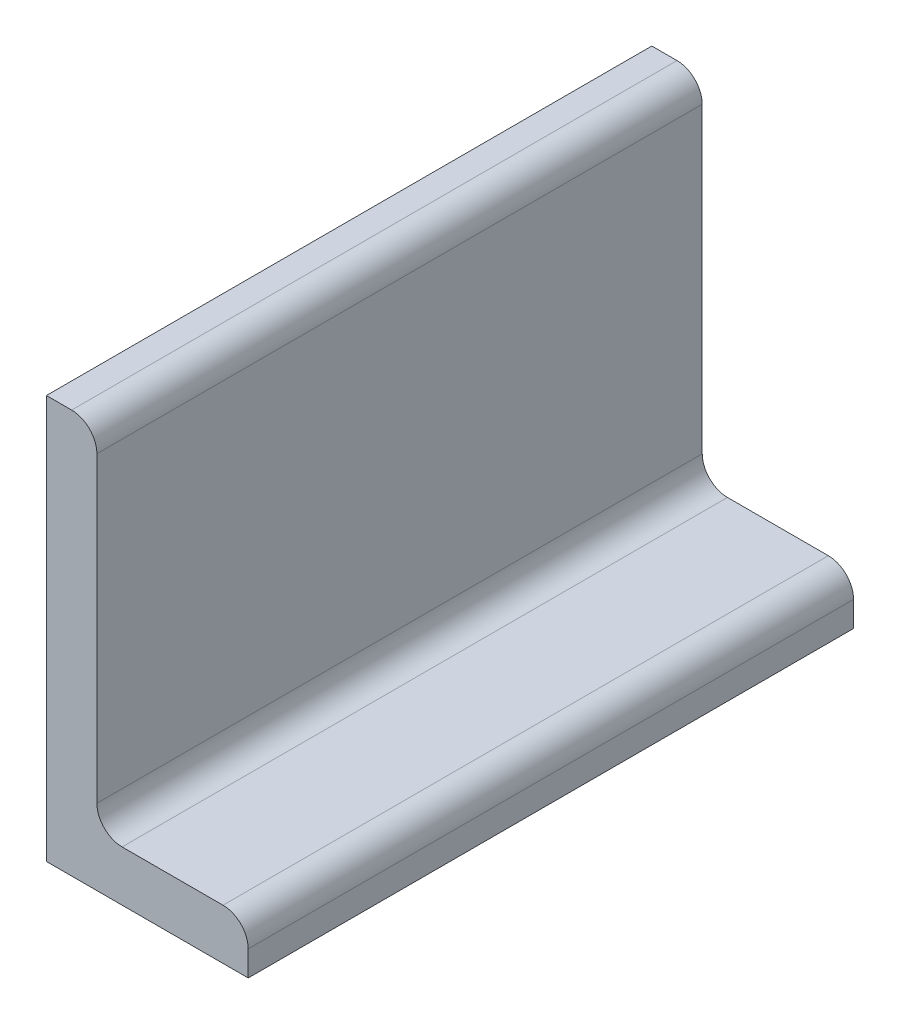
ISO-10303-21;
HEADER;
FILE_DESCRIPTION(('STEP AP214'),'2;1');
FILE_NAME('part.step','',(''),(''),'','','');
FILE_SCHEMA(('AUTOMOTIVE_DESIGN { 1 0 10303 214 1 1 1 1 }'));
ENDSEC;
DATA;
#1=APPLICATION_CONTEXT('core data for automotive mechanical design processes');
#2=APPLICATION_PROTOCOL_DEFINITION('international standard','automotive_design',2000,#1);
#3=PRODUCT_CONTEXT('',#1,'mechanical');
#4=PRODUCT('Part','Part','',(#3));
#5=PRODUCT_RELATED_PRODUCT_CATEGORY('part','',(#4));
#6=PRODUCT_DEFINITION_FORMATION('','',#4);
#7=PRODUCT_DEFINITION_CONTEXT('part definition',#1,'design');
#8=PRODUCT_DEFINITION('design','',#6,#7);
#9=PRODUCT_DEFINITION_SHAPE('','',#8);
#10=(LENGTH_UNIT() NAMED_UNIT(*) SI_UNIT(.MILLI.,.METRE.));
#11=(NAMED_UNIT(*) PLANE_ANGLE_UNIT() SI_UNIT($,.RADIAN.));
#12=(NAMED_UNIT(*) SI_UNIT($,.STERADIAN.) SOLID_ANGLE_UNIT());
#13=UNCERTAINTY_MEASURE_WITH_UNIT(LENGTH_MEASURE(1.E-05),#10,'distance_accuracy_value','');
#14=(GEOMETRIC_REPRESENTATION_CONTEXT(3) GLOBAL_UNCERTAINTY_ASSIGNED_CONTEXT((#13)) GLOBAL_UNIT_ASSIGNED_CONTEXT((#10,
#11,#12)) REPRESENTATION_CONTEXT('',''));
#15=CARTESIAN_POINT('',(0.,0.,0.));
#16=DIRECTION('',(0.,0.,1.));
#17=DIRECTION('',(1.,0.,0.));
#18=AXIS2_PLACEMENT_3D('',#15,#16,#17);
#19=CARTESIAN_POINT('',(0.865045893659089,203.678837479772,304.8));
#20=DIRECTION('',(1.,0.,0.));
#21=DIRECTION('',(0.,0.,-1.));
#22=AXIS2_PLACEMENT_3D('',#19,#20,#21);
#23=PLANE('',#22);
#24=DIRECTION('',(0.,-1.,0.));
#25=VECTOR('',#24,1.);
#26=CARTESIAN_POINT('',(0.865045893659089,203.678837479772,0.));
#27=LINE('',#26,#25);
#28=CARTESIAN_POINT('',(0.865045893659089,203.678837479772,0.));
#29=VERTEX_POINT('',#28);
#30=CARTESIAN_POINT('',(0.865045893659089,0.478837479771708,0.));
#31=VERTEX_POINT('',#30);
#32=EDGE_CURVE('E135',#29,#31,#27,.T.);
#33=ORIENTED_EDGE('',*,*,#32,.T.);
#34=DIRECTION('',(0.,0.,-1.));
#35=VECTOR('',#34,1.);
#36=CARTESIAN_POINT('',(0.865045893659089,0.478837479771708,304.8));
#37=LINE('',#36,#35);
#38=CARTESIAN_POINT('',(0.865045893659089,0.478837479771708,304.8));
#39=VERTEX_POINT('',#38);
#40=EDGE_CURVE('E11',#39,#31,#37,.T.);
#41=ORIENTED_EDGE('',*,*,#40,.F.);
#42=DIRECTION('',(0.,-1.,0.));
#43=VECTOR('',#42,1.);
#44=CARTESIAN_POINT('',(0.865045893659089,203.678837479772,304.8));
#45=LINE('',#44,#43);
#46=CARTESIAN_POINT('',(0.865045893659089,203.678837479772,304.8));
#47=VERTEX_POINT('',#46);
#48=EDGE_CURVE('E151',#47,#39,#45,.T.);
#49=ORIENTED_EDGE('',*,*,#48,.F.);
#50=DIRECTION('',(0.,0.,-1.));
#51=VECTOR('',#50,1.);
#52=CARTESIAN_POINT('',(0.865045893659089,203.678837479772,304.8));
#53=LINE('',#52,#51);
#54=EDGE_CURVE('E131',#47,#29,#53,.T.);
#55=ORIENTED_EDGE('',*,*,#54,.T.);
#56=EDGE_LOOP('',(#33,#41,#49,#55));
#57=FACE_BOUND('',#56,.T.);
#58=ADVANCED_FACE('F33',(#57),#23,.F.);
#59=CARTESIAN_POINT('',(0.865045893659089,0.478837479771708,304.8));
#60=DIRECTION('',(0.,1.,0.));
#61=DIRECTION('',(0.,0.,1.));
#62=AXIS2_PLACEMENT_3D('',#59,#60,#61);
#63=PLANE('',#62);
#64=DIRECTION('',(1.,0.,0.));
#65=VECTOR('',#64,1.);
#66=CARTESIAN_POINT('',(0.865045893659089,0.478837479771708,0.));
#67=LINE('',#66,#65);
#68=CARTESIAN_POINT('',(102.465045893659,0.478837479771708,0.));
#69=VERTEX_POINT('',#68);
#70=EDGE_CURVE('E138',#31,#69,#67,.T.);
#71=ORIENTED_EDGE('',*,*,#70,.T.);
#72=DIRECTION('',(0.,0.,-1.));
#73=VECTOR('',#72,1.);
#74=CARTESIAN_POINT('',(102.465045893659,0.478837479771708,304.8));
#75=LINE('',#74,#73);
#76=CARTESIAN_POINT('',(102.465045893659,0.478837479771708,304.8));
#77=VERTEX_POINT('',#76);
#78=EDGE_CURVE('E41',#77,#69,#75,.T.);
#79=ORIENTED_EDGE('',*,*,#78,.F.);
#80=DIRECTION('',(1.,0.,0.));
#81=VECTOR('',#80,1.);
#82=CARTESIAN_POINT('',(0.865045893659089,0.478837479771708,304.8));
#83=LINE('',#82,#81);
#84=EDGE_CURVE('E95',#39,#77,#83,.T.);
#85=ORIENTED_EDGE('',*,*,#84,.F.);
#86=ORIENTED_EDGE('',*,*,#40,.T.);
#87=EDGE_LOOP('',(#71,#79,#85,#86));
#88=FACE_BOUND('',#87,.T.);
#89=ADVANCED_FACE('F194',(#88),#63,.F.);
#90=CARTESIAN_POINT('',(102.465045893659,0.478837479771708,304.8));
#91=DIRECTION('',(-1.,0.,0.));
#92=DIRECTION('',(0.,0.,1.));
#93=AXIS2_PLACEMENT_3D('',#90,#91,#92);
#94=PLANE('',#93);
#95=DIRECTION('',(0.,1.,0.));
#96=VECTOR('',#95,1.);
#97=CARTESIAN_POINT('',(102.465045893659,0.478837479771708,0.));
#98=LINE('',#97,#96);
#99=CARTESIAN_POINT('',(102.465045893659,13.1788374797717,0.));
#100=VERTEX_POINT('',#99);
#101=EDGE_CURVE('E140',#69,#100,#98,.T.);
#102=ORIENTED_EDGE('',*,*,#101,.T.);
#103=DIRECTION('',(0.,0.,-1.));
#104=VECTOR('',#103,1.);
#105=CARTESIAN_POINT('',(102.465045893659,13.1788374797717,304.8));
#106=LINE('',#105,#104);
#107=CARTESIAN_POINT('',(102.465045893659,13.1788374797717,304.8));
#108=VERTEX_POINT('',#107);
#109=EDGE_CURVE('E161',#108,#100,#106,.T.);
#110=ORIENTED_EDGE('',*,*,#109,.F.);
#111=DIRECTION('',(0.,1.,0.));
#112=VECTOR('',#111,1.);
#113=CARTESIAN_POINT('',(102.465045893659,0.478837479771708,304.8));
#114=LINE('',#113,#112);
#115=EDGE_CURVE('E169',#77,#108,#114,.T.);
#116=ORIENTED_EDGE('',*,*,#115,.F.);
#117=ORIENTED_EDGE('',*,*,#78,.T.);
#118=EDGE_LOOP('',(#102,#110,#116,#117));
#119=FACE_BOUND('',#118,.T.);
#120=ADVANCED_FACE('F167',(#119),#94,.F.);
#121=CARTESIAN_POINT('',(89.7650458936591,13.1788374797717,304.8));
#122=DIRECTION('',(0.,0.,-1.));
#123=DIRECTION('',(-1.,0.,0.));
#124=AXIS2_PLACEMENT_3D('',#121,#122,#123);
#125=CYLINDRICAL_SURFACE('',#124,12.7);
#126=CARTESIAN_POINT('',(89.7650458936591,13.1788374797717,0.));
#127=DIRECTION('',(0.,0.,1.));
#128=DIRECTION('',(1.,0.,0.));
#129=AXIS2_PLACEMENT_3D('',#126,#127,#128);
#130=CIRCLE('',#129,12.7);
#131=CARTESIAN_POINT('',(89.7650458936591,25.8788374797717,0.));
#132=VERTEX_POINT('',#131);
#133=EDGE_CURVE('E142',#100,#132,#130,.T.);
#134=ORIENTED_EDGE('',*,*,#133,.T.);
#135=DIRECTION('',(0.,0.,-1.));
#136=VECTOR('',#135,1.);
#137=CARTESIAN_POINT('',(89.7650458936591,25.8788374797717,304.8));
#138=LINE('',#137,#136);
#139=CARTESIAN_POINT('',(89.7650458936591,25.8788374797717,304.8));
#140=VERTEX_POINT('',#139);
#141=EDGE_CURVE('E158',#140,#132,#138,.T.);
#142=ORIENTED_EDGE('',*,*,#141,.F.);
#143=CARTESIAN_POINT('',(89.7650458936591,13.1788374797717,304.8));
#144=DIRECTION('',(0.,0.,1.));
#145=DIRECTION('',(1.,0.,0.));
#146=AXIS2_PLACEMENT_3D('',#143,#144,#145);
#147=CIRCLE('',#146,12.7);
#148=EDGE_CURVE('E185',#108,#140,#147,.T.);
#149=ORIENTED_EDGE('',*,*,#148,.F.);
#150=ORIENTED_EDGE('',*,*,#109,.T.);
#151=EDGE_LOOP('',(#134,#142,#149,#150));
#152=FACE_BOUND('',#151,.T.);
#153=ADVANCED_FACE('F178',(#152),#125,.T.);
#154=CARTESIAN_POINT('',(89.7650458936591,25.8788374797717,304.8));
#155=DIRECTION('',(0.,-1.,0.));
#156=DIRECTION('',(0.,0.,-1.));
#157=AXIS2_PLACEMENT_3D('',#154,#155,#156);
#158=PLANE('',#157);
#159=DIRECTION('',(-1.,0.,0.));
#160=VECTOR('',#159,1.);
#161=CARTESIAN_POINT('',(89.7650458936591,25.8788374797717,0.));
#162=LINE('',#161,#160);
#163=CARTESIAN_POINT('',(38.9650458936591,25.8788374797717,0.));
#164=VERTEX_POINT('',#163);
#165=EDGE_CURVE('E144',#132,#164,#162,.T.);
#166=ORIENTED_EDGE('',*,*,#165,.T.);
#167=DIRECTION('',(0.,0.,-1.));
#168=VECTOR('',#167,1.);
#169=CARTESIAN_POINT('',(38.9650458936591,25.8788374797717,304.8));
#170=LINE('',#169,#168);
#171=CARTESIAN_POINT('',(38.9650458936591,25.8788374797717,304.8));
#172=VERTEX_POINT('',#171);
#173=EDGE_CURVE('E155',#172,#164,#170,.T.);
#174=ORIENTED_EDGE('',*,*,#173,.F.);
#175=DIRECTION('',(-1.,0.,0.));
#176=VECTOR('',#175,1.);
#177=CARTESIAN_POINT('',(89.7650458936591,25.8788374797717,304.8));
#178=LINE('',#177,#176);
#179=EDGE_CURVE('E184',#140,#172,#178,.T.);
#180=ORIENTED_EDGE('',*,*,#179,.F.);
#181=ORIENTED_EDGE('',*,*,#141,.T.);
#182=EDGE_LOOP('',(#166,#174,#180,#181));
#183=FACE_BOUND('',#182,.T.);
#184=ADVANCED_FACE('F182',(#183),#158,.F.);
#185=CARTESIAN_POINT('',(38.9650458936591,38.5788374797717,304.8));
#186=DIRECTION('',(0.,0.,-1.));
#187=DIRECTION('',(-1.,0.,0.));
#188=AXIS2_PLACEMENT_3D('',#185,#186,#187);
#189=CYLINDRICAL_SURFACE('',#188,12.7);
#190=CARTESIAN_POINT('',(38.9650458936591,38.5788374797717,0.));
#191=DIRECTION('',(0.,0.,-1.));
#192=DIRECTION('',(1.,0.,0.));
#193=AXIS2_PLACEMENT_3D('',#190,#191,#192);
#194=CIRCLE('',#193,12.7);
#195=CARTESIAN_POINT('',(26.2650458936591,38.5788374797717,0.));
#196=VERTEX_POINT('',#195);
#197=EDGE_CURVE('E146',#164,#196,#194,.T.);
#198=ORIENTED_EDGE('',*,*,#197,.T.);
#199=DIRECTION('',(0.,0.,-1.));
#200=VECTOR('',#199,1.);
#201=CARTESIAN_POINT('',(26.2650458936591,38.5788374797717,304.8));
#202=LINE('',#201,#200);
#203=CARTESIAN_POINT('',(26.2650458936591,38.5788374797717,304.8));
#204=VERTEX_POINT('',#203);
#205=EDGE_CURVE('E126',#204,#196,#202,.T.);
#206=ORIENTED_EDGE('',*,*,#205,.F.);
#207=CARTESIAN_POINT('',(38.9650458936591,38.5788374797717,304.8));
#208=DIRECTION('',(0.,0.,-1.));
#209=DIRECTION('',(1.,0.,0.));
#210=AXIS2_PLACEMENT_3D('',#207,#208,#209);
#211=CIRCLE('',#210,12.7);
#212=EDGE_CURVE('E117',#172,#204,#211,.T.);
#213=ORIENTED_EDGE('',*,*,#212,.F.);
#214=ORIENTED_EDGE('',*,*,#173,.T.);
#215=EDGE_LOOP('',(#198,#206,#213,#214));
#216=FACE_BOUND('',#215,.T.);
#217=ADVANCED_FACE('F206',(#216),#189,.F.);
#218=CARTESIAN_POINT('',(26.2650458936591,38.5788374797717,304.8));
#219=DIRECTION('',(-1.,0.,0.));
#220=DIRECTION('',(0.,0.,1.));
#221=AXIS2_PLACEMENT_3D('',#218,#219,#220);
#222=PLANE('',#221);
#223=DIRECTION('',(0.,1.,0.));
#224=VECTOR('',#223,1.);
#225=CARTESIAN_POINT('',(26.2650458936591,38.5788374797717,0.));
#226=LINE('',#225,#224);
#227=CARTESIAN_POINT('',(26.2650458936591,190.978837479772,0.));
#228=VERTEX_POINT('',#227);
#229=EDGE_CURVE('E125',#196,#228,#226,.T.);
#230=ORIENTED_EDGE('',*,*,#229,.T.);
#231=DIRECTION('',(0.,0.,-1.));
#232=VECTOR('',#231,1.);
#233=CARTESIAN_POINT('',(26.2650458936591,190.978837479772,304.8));
#234=LINE('',#233,#232);
#235=CARTESIAN_POINT('',(26.2650458936591,190.978837479772,304.8));
#236=VERTEX_POINT('',#235);
#237=EDGE_CURVE('E122',#236,#228,#234,.T.);
#238=ORIENTED_EDGE('',*,*,#237,.F.);
#239=DIRECTION('',(0.,1.,0.));
#240=VECTOR('',#239,1.);
#241=CARTESIAN_POINT('',(26.2650458936591,38.5788374797717,304.8));
#242=LINE('',#241,#240);
#243=EDGE_CURVE('E111',#204,#236,#242,.T.);
#244=ORIENTED_EDGE('',*,*,#243,.F.);
#245=ORIENTED_EDGE('',*,*,#205,.T.);
#246=EDGE_LOOP('',(#230,#238,#244,#245));
#247=FACE_BOUND('',#246,.T.);
#248=ADVANCED_FACE('F123',(#247),#222,.F.);
#249=CARTESIAN_POINT('',(13.5650458936591,190.978837479772,304.8));
#250=DIRECTION('',(0.,0.,-1.));
#251=DIRECTION('',(-1.,0.,0.));
#252=AXIS2_PLACEMENT_3D('',#249,#250,#251);
#253=CYLINDRICAL_SURFACE('',#252,12.7);
#254=CARTESIAN_POINT('',(13.5650458936591,190.978837479772,0.));
#255=DIRECTION('',(0.,0.,1.));
#256=DIRECTION('',(1.,0.,0.));
#257=AXIS2_PLACEMENT_3D('',#254,#255,#256);
#258=CIRCLE('',#257,12.7);
#259=CARTESIAN_POINT('',(13.5650458936591,203.678837479772,0.));
#260=VERTEX_POINT('',#259);
#261=EDGE_CURVE('E81',#228,#260,#258,.T.);
#262=ORIENTED_EDGE('',*,*,#261,.T.);
#263=DIRECTION('',(0.,0.,-1.));
#264=VECTOR('',#263,1.);
#265=CARTESIAN_POINT('',(13.5650458936591,203.678837479772,304.8));
#266=LINE('',#265,#264);
#267=CARTESIAN_POINT('',(13.5650458936591,203.678837479772,304.8));
#268=VERTEX_POINT('',#267);
#269=EDGE_CURVE('E127',#268,#260,#266,.T.);
#270=ORIENTED_EDGE('',*,*,#269,.F.);
#271=CARTESIAN_POINT('',(13.5650458936591,190.978837479772,304.8));
#272=DIRECTION('',(0.,0.,1.));
#273=DIRECTION('',(1.,0.,0.));
#274=AXIS2_PLACEMENT_3D('',#271,#272,#273);
#275=CIRCLE('',#274,12.7);
#276=EDGE_CURVE('E115',#236,#268,#275,.T.);
#277=ORIENTED_EDGE('',*,*,#276,.F.);
#278=ORIENTED_EDGE('',*,*,#237,.T.);
#279=EDGE_LOOP('',(#262,#270,#277,#278));
#280=FACE_BOUND('',#279,.T.);
#281=ADVANCED_FACE('F129',(#280),#253,.T.);
#282=CARTESIAN_POINT('',(13.5650458936591,203.678837479772,304.8));
#283=DIRECTION('',(0.,-1.,0.));
#284=DIRECTION('',(0.,0.,-1.));
#285=AXIS2_PLACEMENT_3D('',#282,#283,#284);
#286=PLANE('',#285);
#287=DIRECTION('',(-1.,0.,0.));
#288=VECTOR('',#287,1.);
#289=CARTESIAN_POINT('',(13.5650458936591,203.678837479772,0.));
#290=LINE('',#289,#288);
#291=EDGE_CURVE('E87',#260,#29,#290,.T.);
#292=ORIENTED_EDGE('',*,*,#291,.T.);
#293=ORIENTED_EDGE('',*,*,#54,.F.);
#294=DIRECTION('',(-1.,0.,0.));
#295=VECTOR('',#294,1.);
#296=CARTESIAN_POINT('',(13.5650458936591,203.678837479772,304.8));
#297=LINE('',#296,#295);
#298=EDGE_CURVE('E49',#268,#47,#297,.T.);
#299=ORIENTED_EDGE('',*,*,#298,.F.);
#300=ORIENTED_EDGE('',*,*,#269,.T.);
#301=EDGE_LOOP('',(#292,#293,#299,#300));
#302=FACE_BOUND('',#301,.T.);
#303=ADVANCED_FACE('F214',(#302),#286,.F.);
#304=CARTESIAN_POINT('',(89.7650458936591,13.1788374797717,304.8));
#305=DIRECTION('',(0.,0.,1.));
#306=DIRECTION('',(1.,0.,0.));
#307=AXIS2_PLACEMENT_3D('',#304,#305,#306);
#308=PLANE('',#307);
#309=ORIENTED_EDGE('',*,*,#48,.T.);
#310=ORIENTED_EDGE('',*,*,#84,.T.);
#311=ORIENTED_EDGE('',*,*,#115,.T.);
#312=ORIENTED_EDGE('',*,*,#148,.T.);
#313=ORIENTED_EDGE('',*,*,#179,.T.);
#314=ORIENTED_EDGE('',*,*,#212,.T.);
#315=ORIENTED_EDGE('',*,*,#243,.T.);
#316=ORIENTED_EDGE('',*,*,#276,.T.);
#317=ORIENTED_EDGE('',*,*,#298,.T.);
#318=EDGE_LOOP('',(#309,#310,#311,#312,#313,#314,#315,#316,#317));
#319=FACE_BOUND('',#318,.T.);
#320=ADVANCED_FACE('F113',(#319),#308,.T.);
#321=CARTESIAN_POINT('',(89.7650458936591,13.1788374797717,0.));
#322=DIRECTION('',(0.,0.,1.));
#323=DIRECTION('',(1.,0.,0.));
#324=AXIS2_PLACEMENT_3D('',#321,#322,#323);
#325=PLANE('',#324);
#326=ORIENTED_EDGE('',*,*,#32,.F.);
#327=ORIENTED_EDGE('',*,*,#291,.F.);
#328=ORIENTED_EDGE('',*,*,#261,.F.);
#329=ORIENTED_EDGE('',*,*,#229,.F.);
#330=ORIENTED_EDGE('',*,*,#197,.F.);
#331=ORIENTED_EDGE('',*,*,#165,.F.);
#332=ORIENTED_EDGE('',*,*,#133,.F.);
#333=ORIENTED_EDGE('',*,*,#101,.F.);
#334=ORIENTED_EDGE('',*,*,#70,.F.);
#335=EDGE_LOOP('',(#326,#327,#328,#329,#330,#331,#332,#333,#334));
#336=FACE_BOUND('',#335,.T.);
#337=ADVANCED_FACE('F173',(#336),#325,.F.);
#338=CLOSED_SHELL('',(#58,#89,#120,#153,#184,#217,#248,#281,#303,#320,#337));
#339=MANIFOLD_SOLID_BREP('B2',#338);
#340=ADVANCED_BREP_SHAPE_REPRESENTATION('',(#18,#339),#14);
#341=SHAPE_DEFINITION_REPRESENTATION(#9,#340);
ENDSEC;
END-ISO-10303-21;
